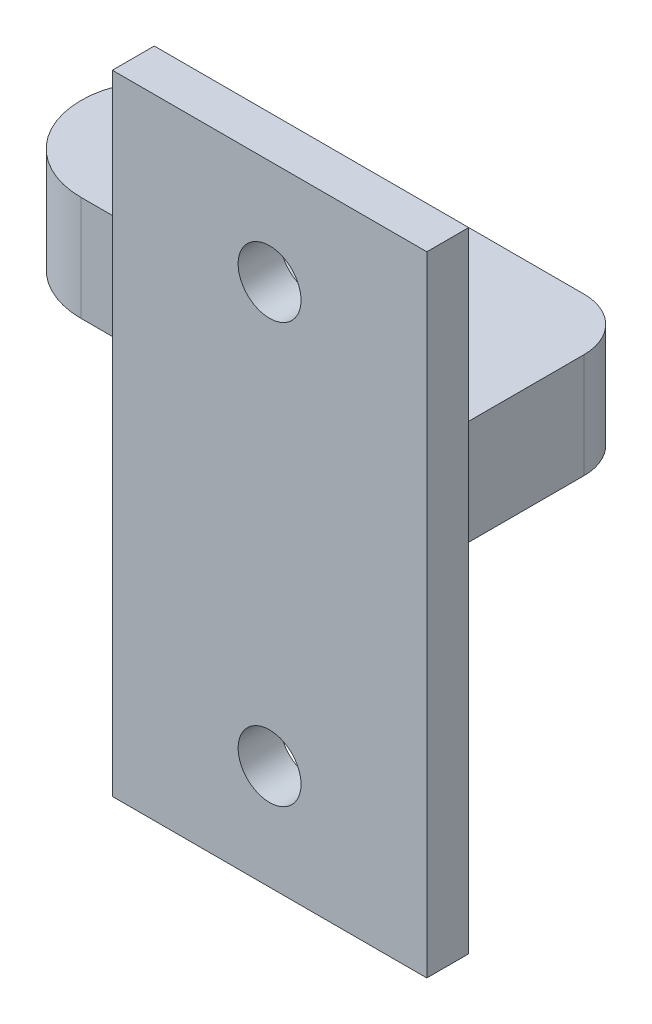
ISO-10303-21;
HEADER;
FILE_DESCRIPTION(('STEP AP214'),'2;1');
FILE_NAME('part.step','',(''),(''),'','','');
FILE_SCHEMA(('AUTOMOTIVE_DESIGN { 1 0 10303 214 1 1 1 1 }'));
ENDSEC;
DATA;
#1=APPLICATION_CONTEXT('core data for automotive mechanical design processes');
#2=APPLICATION_PROTOCOL_DEFINITION('international standard','automotive_design',2000,#1);
#3=PRODUCT_CONTEXT('',#1,'mechanical');
#4=PRODUCT('Part','Part','',(#3));
#5=PRODUCT_RELATED_PRODUCT_CATEGORY('part','',(#4));
#6=PRODUCT_DEFINITION_FORMATION('','',#4);
#7=PRODUCT_DEFINITION_CONTEXT('part definition',#1,'design');
#8=PRODUCT_DEFINITION('design','',#6,#7);
#9=PRODUCT_DEFINITION_SHAPE('','',#8);
#10=(LENGTH_UNIT() NAMED_UNIT(*) SI_UNIT(.MILLI.,.METRE.));
#11=(NAMED_UNIT(*) PLANE_ANGLE_UNIT() SI_UNIT($,.RADIAN.));
#12=(NAMED_UNIT(*) SI_UNIT($,.STERADIAN.) SOLID_ANGLE_UNIT());
#13=UNCERTAINTY_MEASURE_WITH_UNIT(LENGTH_MEASURE(1.E-05),#10,'distance_accuracy_value','');
#14=(GEOMETRIC_REPRESENTATION_CONTEXT(3) GLOBAL_UNCERTAINTY_ASSIGNED_CONTEXT((#13)) GLOBAL_UNIT_ASSIGNED_CONTEXT((#10,
#11,#12)) REPRESENTATION_CONTEXT('',''));
#15=CARTESIAN_POINT('',(0.,0.,0.));
#16=DIRECTION('',(0.,0.,1.));
#17=DIRECTION('',(1.,0.,0.));
#18=AXIS2_PLACEMENT_3D('',#15,#16,#17);
#19=CARTESIAN_POINT('',(0.,0.,2.));
#20=DIRECTION('',(0.,0.,1.));
#21=DIRECTION('',(1.,0.,0.));
#22=AXIS2_PLACEMENT_3D('',#19,#20,#21);
#23=PLANE('',#22);
#24=CARTESIAN_POINT('',(0.,10.,2.));
#25=DIRECTION('',(0.,0.,1.));
#26=DIRECTION('',(1.,0.,0.));
#27=AXIS2_PLACEMENT_3D('',#24,#25,#26);
#28=CIRCLE('',#27,1.5);
#29=CARTESIAN_POINT('',(1.5,10.,2.));
#30=VERTEX_POINT('',#29);
#31=EDGE_CURVE('E205',#30,#30,#28,.T.);
#32=ORIENTED_EDGE('',*,*,#31,.F.);
#33=EDGE_LOOP('',(#32));
#34=FACE_BOUND('',#33,.T.);
#35=DIRECTION('',(0.,1.,0.));
#36=VECTOR('',#35,1.);
#37=CARTESIAN_POINT('',(7.5,15.,2.));
#38=LINE('',#37,#36);
#39=CARTESIAN_POINT('',(7.5,-15.,2.));
#40=VERTEX_POINT('',#39);
#41=CARTESIAN_POINT('',(7.5,15.,2.));
#42=VERTEX_POINT('',#41);
#43=EDGE_CURVE('E206',#40,#42,#38,.T.);
#44=ORIENTED_EDGE('',*,*,#43,.T.);
#45=DIRECTION('',(-1.,0.,0.));
#46=VECTOR('',#45,1.);
#47=CARTESIAN_POINT('',(-7.5,15.,2.));
#48=LINE('',#47,#46);
#49=CARTESIAN_POINT('',(-7.5,15.,2.));
#50=VERTEX_POINT('',#49);
#51=EDGE_CURVE('E93',#42,#50,#48,.T.);
#52=ORIENTED_EDGE('',*,*,#51,.T.);
#53=DIRECTION('',(0.,-1.,0.));
#54=VECTOR('',#53,1.);
#55=CARTESIAN_POINT('',(-7.5,15.,2.));
#56=LINE('',#55,#54);
#57=CARTESIAN_POINT('',(-7.5,-15.,2.));
#58=VERTEX_POINT('',#57);
#59=EDGE_CURVE('E213',#50,#58,#56,.T.);
#60=ORIENTED_EDGE('',*,*,#59,.T.);
#61=DIRECTION('',(1.,0.,0.));
#62=VECTOR('',#61,1.);
#63=CARTESIAN_POINT('',(-7.5,-15.,2.));
#64=LINE('',#63,#62);
#65=EDGE_CURVE('E64',#58,#40,#64,.T.);
#66=ORIENTED_EDGE('',*,*,#65,.T.);
#67=EDGE_LOOP('',(#44,#52,#60,#66));
#68=FACE_BOUND('',#67,.T.);
#69=CARTESIAN_POINT('',(0.,-10.,2.));
#70=DIRECTION('',(0.,0.,1.));
#71=DIRECTION('',(1.,0.,0.));
#72=AXIS2_PLACEMENT_3D('',#69,#70,#71);
#73=CIRCLE('',#72,1.5);
#74=CARTESIAN_POINT('',(1.5,-10.,2.));
#75=VERTEX_POINT('',#74);
#76=EDGE_CURVE('E198',#75,#75,#73,.T.);
#77=ORIENTED_EDGE('',*,*,#76,.F.);
#78=EDGE_LOOP('',(#77));
#79=FACE_BOUND('',#78,.T.);
#80=ADVANCED_FACE('F41',(#34,#68,#79),#23,.T.);
#81=CARTESIAN_POINT('',(0.,0.,0.));
#82=DIRECTION('',(0.,0.,1.));
#83=DIRECTION('',(1.,0.,0.));
#84=AXIS2_PLACEMENT_3D('',#81,#82,#83);
#85=PLANE('',#84);
#86=DIRECTION('',(0.,-1.,0.));
#87=VECTOR('',#86,1.);
#88=CARTESIAN_POINT('',(-3.,2.5,0.));
#89=LINE('',#88,#87);
#90=CARTESIAN_POINT('',(-3.,2.5,0.));
#91=VERTEX_POINT('',#90);
#92=CARTESIAN_POINT('',(-3.,-2.5,0.));
#93=VERTEX_POINT('',#92);
#94=EDGE_CURVE('E147',#91,#93,#89,.T.);
#95=ORIENTED_EDGE('',*,*,#94,.T.);
#96=DIRECTION('',(1.,0.,0.));
#97=VECTOR('',#96,1.);
#98=CARTESIAN_POINT('',(-3.,-2.5,0.));
#99=LINE('',#98,#97);
#100=CARTESIAN_POINT('',(3.,-2.5,0.));
#101=VERTEX_POINT('',#100);
#102=EDGE_CURVE('E169',#93,#101,#99,.T.);
#103=ORIENTED_EDGE('',*,*,#102,.T.);
#104=DIRECTION('',(0.,-1.,0.));
#105=VECTOR('',#104,1.);
#106=CARTESIAN_POINT('',(3.,2.5,0.));
#107=LINE('',#106,#105);
#108=CARTESIAN_POINT('',(3.,2.5,0.));
#109=VERTEX_POINT('',#108);
#110=EDGE_CURVE('E153',#109,#101,#107,.T.);
#111=ORIENTED_EDGE('',*,*,#110,.F.);
#112=DIRECTION('',(1.,0.,0.));
#113=VECTOR('',#112,1.);
#114=CARTESIAN_POINT('',(-3.,2.5,0.));
#115=LINE('',#114,#113);
#116=EDGE_CURVE('E138',#91,#109,#115,.T.);
#117=ORIENTED_EDGE('',*,*,#116,.F.);
#118=EDGE_LOOP('',(#95,#103,#111,#117));
#119=FACE_BOUND('',#118,.T.);
#120=DIRECTION('',(0.,1.,0.));
#121=VECTOR('',#120,1.);
#122=CARTESIAN_POINT('',(7.5,15.,0.));
#123=LINE('',#122,#121);
#124=CARTESIAN_POINT('',(7.5,-15.,0.));
#125=VERTEX_POINT('',#124);
#126=CARTESIAN_POINT('',(7.5,15.,0.));
#127=VERTEX_POINT('',#126);
#128=EDGE_CURVE('E203',#125,#127,#123,.T.);
#129=ORIENTED_EDGE('',*,*,#128,.F.);
#130=DIRECTION('',(1.,0.,0.));
#131=VECTOR('',#130,1.);
#132=CARTESIAN_POINT('',(-7.5,-15.,0.));
#133=LINE('',#132,#131);
#134=CARTESIAN_POINT('',(-7.5,-15.,0.));
#135=VERTEX_POINT('',#134);
#136=EDGE_CURVE('E86',#135,#125,#133,.T.);
#137=ORIENTED_EDGE('',*,*,#136,.F.);
#138=DIRECTION('',(0.,-1.,0.));
#139=VECTOR('',#138,1.);
#140=CARTESIAN_POINT('',(-7.5,15.,0.));
#141=LINE('',#140,#139);
#142=CARTESIAN_POINT('',(-7.5,15.,0.));
#143=VERTEX_POINT('',#142);
#144=EDGE_CURVE('E219',#143,#135,#141,.T.);
#145=ORIENTED_EDGE('',*,*,#144,.F.);
#146=DIRECTION('',(-1.,0.,0.));
#147=VECTOR('',#146,1.);
#148=CARTESIAN_POINT('',(-7.5,15.,0.));
#149=LINE('',#148,#147);
#150=EDGE_CURVE('E220',#127,#143,#149,.T.);
#151=ORIENTED_EDGE('',*,*,#150,.F.);
#152=EDGE_LOOP('',(#129,#137,#145,#151));
#153=FACE_BOUND('',#152,.T.);
#154=CARTESIAN_POINT('',(0.,10.,0.));
#155=DIRECTION('',(0.,0.,1.));
#156=DIRECTION('',(1.,0.,0.));
#157=AXIS2_PLACEMENT_3D('',#154,#155,#156);
#158=CIRCLE('',#157,1.5);
#159=CARTESIAN_POINT('',(1.5,10.,0.));
#160=VERTEX_POINT('',#159);
#161=EDGE_CURVE('E197',#160,#160,#158,.T.);
#162=ORIENTED_EDGE('',*,*,#161,.T.);
#163=EDGE_LOOP('',(#162));
#164=FACE_BOUND('',#163,.T.);
#165=CARTESIAN_POINT('',(0.,-10.,0.));
#166=DIRECTION('',(0.,0.,1.));
#167=DIRECTION('',(1.,0.,0.));
#168=AXIS2_PLACEMENT_3D('',#165,#166,#167);
#169=CIRCLE('',#168,1.5);
#170=CARTESIAN_POINT('',(1.5,-10.,0.));
#171=VERTEX_POINT('',#170);
#172=EDGE_CURVE('E148',#171,#171,#169,.T.);
#173=ORIENTED_EDGE('',*,*,#172,.T.);
#174=EDGE_LOOP('',(#173));
#175=FACE_BOUND('',#174,.T.);
#176=ADVANCED_FACE('F152',(#119,#153,#164,#175),#85,.F.);
#177=CARTESIAN_POINT('',(7.5,15.,2.));
#178=DIRECTION('',(-1.,0.,0.));
#179=DIRECTION('',(0.,-1.,0.));
#180=AXIS2_PLACEMENT_3D('',#177,#178,#179);
#181=PLANE('',#180);
#182=ORIENTED_EDGE('',*,*,#128,.T.);
#183=DIRECTION('',(0.,0.,-1.));
#184=VECTOR('',#183,1.);
#185=CARTESIAN_POINT('',(7.5,15.,2.));
#186=LINE('',#185,#184);
#187=EDGE_CURVE('E11',#42,#127,#186,.T.);
#188=ORIENTED_EDGE('',*,*,#187,.F.);
#189=ORIENTED_EDGE('',*,*,#43,.F.);
#190=DIRECTION('',(0.,0.,-1.));
#191=VECTOR('',#190,1.);
#192=CARTESIAN_POINT('',(7.5,-15.,2.));
#193=LINE('',#192,#191);
#194=EDGE_CURVE('E215',#40,#125,#193,.T.);
#195=ORIENTED_EDGE('',*,*,#194,.T.);
#196=EDGE_LOOP('',(#182,#188,#189,#195));
#197=FACE_BOUND('',#196,.T.);
#198=ADVANCED_FACE('F43',(#197),#181,.F.);
#199=CARTESIAN_POINT('',(-7.5,15.,2.));
#200=DIRECTION('',(0.,-1.,0.));
#201=DIRECTION('',(0.,0.,-1.));
#202=AXIS2_PLACEMENT_3D('',#199,#200,#201);
#203=PLANE('',#202);
#204=ORIENTED_EDGE('',*,*,#150,.T.);
#205=DIRECTION('',(0.,0.,-1.));
#206=VECTOR('',#205,1.);
#207=CARTESIAN_POINT('',(-7.5,15.,2.));
#208=LINE('',#207,#206);
#209=EDGE_CURVE('E47',#50,#143,#208,.T.);
#210=ORIENTED_EDGE('',*,*,#209,.F.);
#211=ORIENTED_EDGE('',*,*,#51,.F.);
#212=ORIENTED_EDGE('',*,*,#187,.T.);
#213=EDGE_LOOP('',(#204,#210,#211,#212));
#214=FACE_BOUND('',#213,.T.);
#215=ADVANCED_FACE('F247',(#214),#203,.F.);
#216=CARTESIAN_POINT('',(-7.5,15.,2.));
#217=DIRECTION('',(1.,0.,0.));
#218=DIRECTION('',(0.,1.,0.));
#219=AXIS2_PLACEMENT_3D('',#216,#217,#218);
#220=PLANE('',#219);
#221=ORIENTED_EDGE('',*,*,#144,.T.);
#222=DIRECTION('',(0.,0.,-1.));
#223=VECTOR('',#222,1.);
#224=CARTESIAN_POINT('',(-7.5,-15.,2.));
#225=LINE('',#224,#223);
#226=EDGE_CURVE('E223',#58,#135,#225,.T.);
#227=ORIENTED_EDGE('',*,*,#226,.F.);
#228=ORIENTED_EDGE('',*,*,#59,.F.);
#229=ORIENTED_EDGE('',*,*,#209,.T.);
#230=EDGE_LOOP('',(#221,#227,#228,#229));
#231=FACE_BOUND('',#230,.T.);
#232=ADVANCED_FACE('F228',(#231),#220,.F.);
#233=CARTESIAN_POINT('',(-7.5,-15.,2.));
#234=DIRECTION('',(0.,1.,0.));
#235=DIRECTION('',(0.,0.,1.));
#236=AXIS2_PLACEMENT_3D('',#233,#234,#235);
#237=PLANE('',#236);
#238=ORIENTED_EDGE('',*,*,#136,.T.);
#239=ORIENTED_EDGE('',*,*,#194,.F.);
#240=ORIENTED_EDGE('',*,*,#65,.F.);
#241=ORIENTED_EDGE('',*,*,#226,.T.);
#242=EDGE_LOOP('',(#238,#239,#240,#241));
#243=FACE_BOUND('',#242,.T.);
#244=ADVANCED_FACE('F234',(#243),#237,.F.);
#245=CARTESIAN_POINT('',(0.,10.,2.));
#246=DIRECTION('',(0.,0.,-1.));
#247=DIRECTION('',(-1.,0.,0.));
#248=AXIS2_PLACEMENT_3D('',#245,#246,#247);
#249=CYLINDRICAL_SURFACE('',#248,1.5);
#250=ORIENTED_EDGE('',*,*,#31,.T.);
#251=EDGE_LOOP('',(#250));
#252=FACE_BOUND('',#251,.T.);
#253=ORIENTED_EDGE('',*,*,#161,.F.);
#254=EDGE_LOOP('',(#253));
#255=FACE_BOUND('',#254,.T.);
#256=ADVANCED_FACE('F240',(#252,#255),#249,.F.);
#257=CARTESIAN_POINT('',(0.,-10.,2.));
#258=DIRECTION('',(0.,0.,-1.));
#259=DIRECTION('',(-1.,0.,0.));
#260=AXIS2_PLACEMENT_3D('',#257,#258,#259);
#261=CYLINDRICAL_SURFACE('',#260,1.5);
#262=ORIENTED_EDGE('',*,*,#76,.T.);
#263=EDGE_LOOP('',(#262));
#264=FACE_BOUND('',#263,.T.);
#265=ORIENTED_EDGE('',*,*,#172,.F.);
#266=EDGE_LOOP('',(#265));
#267=FACE_BOUND('',#266,.T.);
#268=ADVANCED_FACE('F241',(#264,#267),#261,.F.);
#269=CARTESIAN_POINT('',(-7.5,2.5,0.));
#270=DIRECTION('',(0.,1.,0.));
#271=DIRECTION('',(0.,0.,1.));
#272=AXIS2_PLACEMENT_3D('',#269,#270,#271);
#273=PLANE('',#272);
#274=CARTESIAN_POINT('',(-7.5,2.5,0.));
#275=DIRECTION('',(0.,-1.,0.));
#276=DIRECTION('',(0.,0.,1.));
#277=AXIS2_PLACEMENT_3D('',#274,#275,#276);
#278=CIRCLE('',#277,4.5);
#279=CARTESIAN_POINT('',(-7.5,2.5,-4.5));
#280=VERTEX_POINT('',#279);
#281=EDGE_CURVE('E132',#280,#91,#278,.T.);
#282=ORIENTED_EDGE('',*,*,#281,.T.);
#283=ORIENTED_EDGE('',*,*,#116,.T.);
#284=DIRECTION('',(0.,0.,-1.));
#285=VECTOR('',#284,1.);
#286=CARTESIAN_POINT('',(3.,2.5,-10.));
#287=LINE('',#286,#285);
#288=CARTESIAN_POINT('',(3.,2.5,-10.));
#289=VERTEX_POINT('',#288);
#290=EDGE_CURVE('E157',#109,#289,#287,.T.);
#291=ORIENTED_EDGE('',*,*,#290,.T.);
#292=CARTESIAN_POINT('',(0.499999999999999,2.5,-10.));
#293=DIRECTION('',(0.,1.,0.));
#294=DIRECTION('',(0.,0.,1.));
#295=AXIS2_PLACEMENT_3D('',#292,#293,#294);
#296=CIRCLE('',#295,2.5);
#297=CARTESIAN_POINT('',(0.499999999999999,2.5,-12.5));
#298=VERTEX_POINT('',#297);
#299=EDGE_CURVE('E156',#289,#298,#296,.T.);
#300=ORIENTED_EDGE('',*,*,#299,.T.);
#301=DIRECTION('',(-1.,0.,0.));
#302=VECTOR('',#301,1.);
#303=CARTESIAN_POINT('',(-15.5,2.5,-12.5));
#304=LINE('',#303,#302);
#305=CARTESIAN_POINT('',(-15.5,2.5,-12.5));
#306=VERTEX_POINT('',#305);
#307=EDGE_CURVE('E161',#298,#306,#304,.T.);
#308=ORIENTED_EDGE('',*,*,#307,.T.);
#309=CARTESIAN_POINT('',(-15.5,2.5,-8.5));
#310=DIRECTION('',(0.,1.,0.));
#311=DIRECTION('',(0.,0.,1.));
#312=AXIS2_PLACEMENT_3D('',#309,#310,#311);
#313=CIRCLE('',#312,4.);
#314=CARTESIAN_POINT('',(-15.5,2.5,-4.5));
#315=VERTEX_POINT('',#314);
#316=EDGE_CURVE('E164',#306,#315,#313,.T.);
#317=ORIENTED_EDGE('',*,*,#316,.T.);
#318=DIRECTION('',(1.,0.,0.));
#319=VECTOR('',#318,1.);
#320=CARTESIAN_POINT('',(-7.5,2.5,-4.5));
#321=LINE('',#320,#319);
#322=EDGE_CURVE('E141',#315,#280,#321,.T.);
#323=ORIENTED_EDGE('',*,*,#322,.T.);
#324=EDGE_LOOP('',(#282,#283,#291,#300,#308,#317,#323));
#325=FACE_BOUND('',#324,.T.);
#326=CARTESIAN_POINT('',(-15.5,2.5,-8.5));
#327=DIRECTION('',(0.,1.,0.));
#328=DIRECTION('',(0.,0.,1.));
#329=AXIS2_PLACEMENT_3D('',#326,#327,#328);
#330=CIRCLE('',#329,1.5);
#331=CARTESIAN_POINT('',(-15.5,2.5,-7.));
#332=VERTEX_POINT('',#331);
#333=EDGE_CURVE('E173',#332,#332,#330,.T.);
#334=ORIENTED_EDGE('',*,*,#333,.F.);
#335=EDGE_LOOP('',(#334));
#336=FACE_BOUND('',#335,.T.);
#337=ADVANCED_FACE('F134',(#325,#336),#273,.T.);
#338=CARTESIAN_POINT('',(-7.5,-2.5,0.));
#339=DIRECTION('',(0.,1.,0.));
#340=DIRECTION('',(0.,0.,1.));
#341=AXIS2_PLACEMENT_3D('',#338,#339,#340);
#342=PLANE('',#341);
#343=CARTESIAN_POINT('',(-7.5,-2.5,0.));
#344=DIRECTION('',(0.,-1.,0.));
#345=DIRECTION('',(0.,0.,1.));
#346=AXIS2_PLACEMENT_3D('',#343,#344,#345);
#347=CIRCLE('',#346,4.5);
#348=CARTESIAN_POINT('',(-7.5,-2.5,-4.5));
#349=VERTEX_POINT('',#348);
#350=EDGE_CURVE('E57',#349,#93,#347,.T.);
#351=ORIENTED_EDGE('',*,*,#350,.F.);
#352=DIRECTION('',(1.,0.,0.));
#353=VECTOR('',#352,1.);
#354=CARTESIAN_POINT('',(-7.5,-2.5,-4.5));
#355=LINE('',#354,#353);
#356=CARTESIAN_POINT('',(-15.5,-2.5,-4.5));
#357=VERTEX_POINT('',#356);
#358=EDGE_CURVE('E142',#357,#349,#355,.T.);
#359=ORIENTED_EDGE('',*,*,#358,.F.);
#360=CARTESIAN_POINT('',(-15.5,-2.5,-8.5));
#361=DIRECTION('',(0.,1.,0.));
#362=DIRECTION('',(0.,0.,1.));
#363=AXIS2_PLACEMENT_3D('',#360,#361,#362);
#364=CIRCLE('',#363,4.);
#365=CARTESIAN_POINT('',(-15.5,-2.5,-12.5));
#366=VERTEX_POINT('',#365);
#367=EDGE_CURVE('E177',#366,#357,#364,.T.);
#368=ORIENTED_EDGE('',*,*,#367,.F.);
#369=DIRECTION('',(-1.,0.,0.));
#370=VECTOR('',#369,1.);
#371=CARTESIAN_POINT('',(-15.5,-2.5,-12.5));
#372=LINE('',#371,#370);
#373=CARTESIAN_POINT('',(0.499999999999999,-2.5,-12.5));
#374=VERTEX_POINT('',#373);
#375=EDGE_CURVE('E180',#374,#366,#372,.T.);
#376=ORIENTED_EDGE('',*,*,#375,.F.);
#377=CARTESIAN_POINT('',(0.499999999999999,-2.5,-10.));
#378=DIRECTION('',(0.,1.,0.));
#379=DIRECTION('',(0.,0.,1.));
#380=AXIS2_PLACEMENT_3D('',#377,#378,#379);
#381=CIRCLE('',#380,2.5);
#382=CARTESIAN_POINT('',(3.,-2.5,-10.));
#383=VERTEX_POINT('',#382);
#384=EDGE_CURVE('E172',#383,#374,#381,.T.);
#385=ORIENTED_EDGE('',*,*,#384,.F.);
#386=DIRECTION('',(0.,0.,-1.));
#387=VECTOR('',#386,1.);
#388=CARTESIAN_POINT('',(3.,-2.5,-10.));
#389=LINE('',#388,#387);
#390=EDGE_CURVE('E171',#101,#383,#389,.T.);
#391=ORIENTED_EDGE('',*,*,#390,.F.);
#392=ORIENTED_EDGE('',*,*,#102,.F.);
#393=EDGE_LOOP('',(#351,#359,#368,#376,#385,#391,#392));
#394=FACE_BOUND('',#393,.T.);
#395=CARTESIAN_POINT('',(-15.5,-2.5,-8.5));
#396=DIRECTION('',(0.,1.,0.));
#397=DIRECTION('',(0.,0.,1.));
#398=AXIS2_PLACEMENT_3D('',#395,#396,#397);
#399=CIRCLE('',#398,1.5);
#400=CARTESIAN_POINT('',(-15.5,-2.5,-7.));
#401=VERTEX_POINT('',#400);
#402=EDGE_CURVE('E297',#401,#401,#399,.T.);
#403=ORIENTED_EDGE('',*,*,#402,.T.);
#404=EDGE_LOOP('',(#403));
#405=FACE_BOUND('',#404,.T.);
#406=ADVANCED_FACE('F264',(#394,#405),#342,.F.);
#407=CARTESIAN_POINT('',(-7.5,2.5,0.));
#408=DIRECTION('',(0.,-1.,0.));
#409=DIRECTION('',(0.,0.,-1.));
#410=AXIS2_PLACEMENT_3D('',#407,#408,#409);
#411=CYLINDRICAL_SURFACE('',#410,4.5);
#412=ORIENTED_EDGE('',*,*,#350,.T.);
#413=ORIENTED_EDGE('',*,*,#94,.F.);
#414=ORIENTED_EDGE('',*,*,#281,.F.);
#415=DIRECTION('',(0.,-1.,0.));
#416=VECTOR('',#415,1.);
#417=CARTESIAN_POINT('',(-7.5,2.5,-4.5));
#418=LINE('',#417,#416);
#419=EDGE_CURVE('E166',#280,#349,#418,.T.);
#420=ORIENTED_EDGE('',*,*,#419,.T.);
#421=EDGE_LOOP('',(#412,#413,#414,#420));
#422=FACE_BOUND('',#421,.T.);
#423=ADVANCED_FACE('F150',(#422),#411,.F.);
#424=CARTESIAN_POINT('',(3.,2.5,-10.));
#425=DIRECTION('',(-1.,0.,0.));
#426=DIRECTION('',(0.,0.,1.));
#427=AXIS2_PLACEMENT_3D('',#424,#425,#426);
#428=PLANE('',#427);
#429=ORIENTED_EDGE('',*,*,#390,.T.);
#430=DIRECTION('',(0.,-1.,0.));
#431=VECTOR('',#430,1.);
#432=CARTESIAN_POINT('',(3.,2.5,-10.));
#433=LINE('',#432,#431);
#434=EDGE_CURVE('E195',#289,#383,#433,.T.);
#435=ORIENTED_EDGE('',*,*,#434,.F.);
#436=ORIENTED_EDGE('',*,*,#290,.F.);
#437=ORIENTED_EDGE('',*,*,#110,.T.);
#438=EDGE_LOOP('',(#429,#435,#436,#437));
#439=FACE_BOUND('',#438,.T.);
#440=ADVANCED_FACE('F261',(#439),#428,.F.);
#441=CARTESIAN_POINT('',(0.499999999999999,2.5,-10.));
#442=DIRECTION('',(0.,-1.,0.));
#443=DIRECTION('',(0.,0.,-1.));
#444=AXIS2_PLACEMENT_3D('',#441,#442,#443);
#445=CYLINDRICAL_SURFACE('',#444,2.5);
#446=ORIENTED_EDGE('',*,*,#384,.T.);
#447=DIRECTION('',(0.,-1.,0.));
#448=VECTOR('',#447,1.);
#449=CARTESIAN_POINT('',(0.499999999999999,2.5,-12.5));
#450=LINE('',#449,#448);
#451=EDGE_CURVE('E188',#298,#374,#450,.T.);
#452=ORIENTED_EDGE('',*,*,#451,.F.);
#453=ORIENTED_EDGE('',*,*,#299,.F.);
#454=ORIENTED_EDGE('',*,*,#434,.T.);
#455=EDGE_LOOP('',(#446,#452,#453,#454));
#456=FACE_BOUND('',#455,.T.);
#457=ADVANCED_FACE('F270',(#456),#445,.T.);
#458=CARTESIAN_POINT('',(-15.5,2.5,-12.5));
#459=DIRECTION('',(0.,0.,1.));
#460=DIRECTION('',(1.,0.,0.));
#461=AXIS2_PLACEMENT_3D('',#458,#459,#460);
#462=PLANE('',#461);
#463=ORIENTED_EDGE('',*,*,#375,.T.);
#464=DIRECTION('',(0.,-1.,0.));
#465=VECTOR('',#464,1.);
#466=CARTESIAN_POINT('',(-15.5,2.5,-12.5));
#467=LINE('',#466,#465);
#468=EDGE_CURVE('E186',#306,#366,#467,.T.);
#469=ORIENTED_EDGE('',*,*,#468,.F.);
#470=ORIENTED_EDGE('',*,*,#307,.F.);
#471=ORIENTED_EDGE('',*,*,#451,.T.);
#472=EDGE_LOOP('',(#463,#469,#470,#471));
#473=FACE_BOUND('',#472,.T.);
#474=ADVANCED_FACE('F271',(#473),#462,.F.);
#475=CARTESIAN_POINT('',(-15.5,2.5,-8.5));
#476=DIRECTION('',(0.,-1.,0.));
#477=DIRECTION('',(0.,0.,-1.));
#478=AXIS2_PLACEMENT_3D('',#475,#476,#477);
#479=CYLINDRICAL_SURFACE('',#478,4.);
#480=ORIENTED_EDGE('',*,*,#367,.T.);
#481=DIRECTION('',(0.,-1.,0.));
#482=VECTOR('',#481,1.);
#483=CARTESIAN_POINT('',(-15.5,2.5,-4.5));
#484=LINE('',#483,#482);
#485=EDGE_CURVE('E183',#315,#357,#484,.T.);
#486=ORIENTED_EDGE('',*,*,#485,.F.);
#487=ORIENTED_EDGE('',*,*,#316,.F.);
#488=ORIENTED_EDGE('',*,*,#468,.T.);
#489=EDGE_LOOP('',(#480,#486,#487,#488));
#490=FACE_BOUND('',#489,.T.);
#491=ADVANCED_FACE('F274',(#490),#479,.T.);
#492=CARTESIAN_POINT('',(-7.5,2.5,-4.5));
#493=DIRECTION('',(0.,0.,-1.));
#494=DIRECTION('',(-1.,0.,0.));
#495=AXIS2_PLACEMENT_3D('',#492,#493,#494);
#496=PLANE('',#495);
#497=ORIENTED_EDGE('',*,*,#358,.T.);
#498=ORIENTED_EDGE('',*,*,#419,.F.);
#499=ORIENTED_EDGE('',*,*,#322,.F.);
#500=ORIENTED_EDGE('',*,*,#485,.T.);
#501=EDGE_LOOP('',(#497,#498,#499,#500));
#502=FACE_BOUND('',#501,.T.);
#503=ADVANCED_FACE('F278',(#502),#496,.F.);
#504=CARTESIAN_POINT('',(-15.5,2.5,-8.5));
#505=DIRECTION('',(0.,-1.,0.));
#506=DIRECTION('',(0.,0.,-1.));
#507=AXIS2_PLACEMENT_3D('',#504,#505,#506);
#508=CYLINDRICAL_SURFACE('',#507,1.5);
#509=ORIENTED_EDGE('',*,*,#333,.T.);
#510=EDGE_LOOP('',(#509));
#511=FACE_BOUND('',#510,.T.);
#512=ORIENTED_EDGE('',*,*,#402,.F.);
#513=EDGE_LOOP('',(#512));
#514=FACE_BOUND('',#513,.T.);
#515=ADVANCED_FACE('F284',(#511,#514),#508,.F.);
#516=CLOSED_SHELL('',(#80,#176,#198,#215,#232,#244,#256,#268,#337,#406,#423,#440,#457,#474,#491,
#503,#515));
#517=MANIFOLD_SOLID_BREP('B2',#516);
#518=ADVANCED_BREP_SHAPE_REPRESENTATION('',(#18,#517),#14);
#519=SHAPE_DEFINITION_REPRESENTATION(#9,#518);
ENDSEC;
END-ISO-10303-21;
